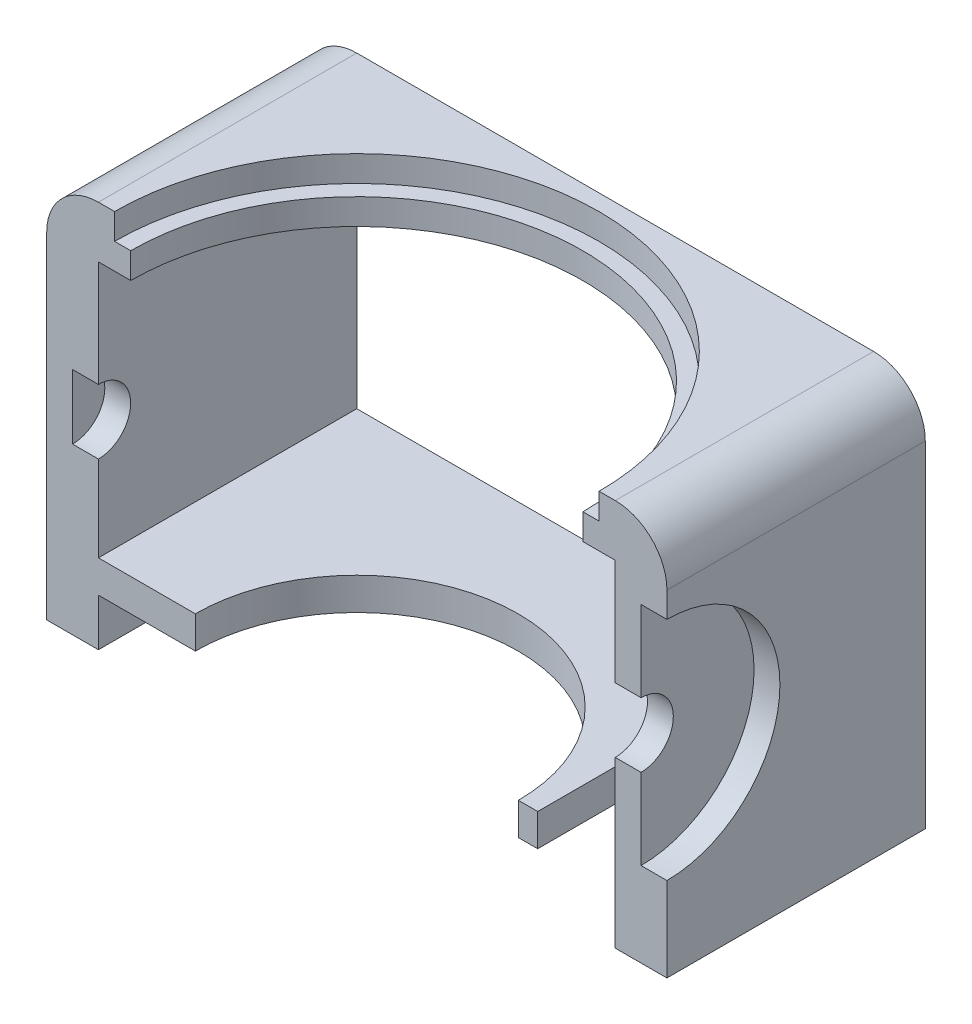
ISO-10303-21;
HEADER;
FILE_DESCRIPTION(('STEP AP214'),'2;1');
FILE_NAME('part.step','',(''),(''),'','','');
FILE_SCHEMA(('AUTOMOTIVE_DESIGN { 1 0 10303 214 1 1 1 1 }'));
ENDSEC;
DATA;
#1=APPLICATION_CONTEXT('core data for automotive mechanical design processes');
#2=APPLICATION_PROTOCOL_DEFINITION('international standard','automotive_design',2000,#1);
#3=PRODUCT_CONTEXT('',#1,'mechanical');
#4=PRODUCT('Part','Part','',(#3));
#5=PRODUCT_RELATED_PRODUCT_CATEGORY('part','',(#4));
#6=PRODUCT_DEFINITION_FORMATION('','',#4);
#7=PRODUCT_DEFINITION_CONTEXT('part definition',#1,'design');
#8=PRODUCT_DEFINITION('design','',#6,#7);
#9=PRODUCT_DEFINITION_SHAPE('','',#8);
#10=(LENGTH_UNIT() NAMED_UNIT(*) SI_UNIT(.MILLI.,.METRE.));
#11=(NAMED_UNIT(*) PLANE_ANGLE_UNIT() SI_UNIT($,.RADIAN.));
#12=(NAMED_UNIT(*) SI_UNIT($,.STERADIAN.) SOLID_ANGLE_UNIT());
#13=UNCERTAINTY_MEASURE_WITH_UNIT(LENGTH_MEASURE(1.E-05),#10,'distance_accuracy_value','');
#14=(GEOMETRIC_REPRESENTATION_CONTEXT(3) GLOBAL_UNCERTAINTY_ASSIGNED_CONTEXT((#13)) GLOBAL_UNIT_ASSIGNED_CONTEXT((#10,
#11,#12)) REPRESENTATION_CONTEXT('',''));
#15=CARTESIAN_POINT('',(0.,0.,0.));
#16=DIRECTION('',(0.,0.,1.));
#17=DIRECTION('',(1.,0.,0.));
#18=AXIS2_PLACEMENT_3D('',#15,#16,#17);
#19=CARTESIAN_POINT('',(0.,0.,80.));
#20=DIRECTION('',(-1.,0.,0.));
#21=DIRECTION('',(0.,0.,1.));
#22=AXIS2_PLACEMENT_3D('',#19,#20,#21);
#23=PLANE('',#22);
#24=DIRECTION('',(0.,1.,0.));
#25=VECTOR('',#24,1.);
#26=CARTESIAN_POINT('',(0.,0.,39.99));
#27=LINE('',#26,#25);
#28=CARTESIAN_POINT('',(0.,0.,39.99));
#29=VERTEX_POINT('',#28);
#30=CARTESIAN_POINT('',(0.,13.0700028571431,39.99));
#31=VERTEX_POINT('',#30);
#32=EDGE_CURVE('E281',#29,#31,#27,.T.);
#33=ORIENTED_EDGE('',*,*,#32,.F.);
#34=DIRECTION('',(0.,0.,-1.));
#35=VECTOR('',#34,1.);
#36=CARTESIAN_POINT('',(0.,0.,80.));
#37=LINE('',#36,#35);
#38=CARTESIAN_POINT('',(0.,0.,0.));
#39=VERTEX_POINT('',#38);
#40=EDGE_CURVE('E272',#29,#39,#37,.T.);
#41=ORIENTED_EDGE('',*,*,#40,.T.);
#42=DIRECTION('',(0.,1.,0.));
#43=VECTOR('',#42,1.);
#44=CARTESIAN_POINT('',(0.,0.,0.));
#45=LINE('',#44,#43);
#46=CARTESIAN_POINT('',(0.,52.,0.));
#47=VERTEX_POINT('',#46);
#48=EDGE_CURVE('E271',#39,#47,#45,.T.);
#49=ORIENTED_EDGE('',*,*,#48,.T.);
#50=DIRECTION('',(0.,0.,-1.));
#51=VECTOR('',#50,1.);
#52=CARTESIAN_POINT('',(0.,52.,80.));
#53=LINE('',#52,#51);
#54=CARTESIAN_POINT('',(0.,52.,39.99));
#55=VERTEX_POINT('',#54);
#56=EDGE_CURVE('E268',#55,#47,#53,.T.);
#57=ORIENTED_EDGE('',*,*,#56,.F.);
#58=CARTESIAN_POINT('',(0.,48.0699971428569,39.99));
#59=VERTEX_POINT('',#58);
#60=EDGE_CURVE('E277',#59,#55,#27,.T.);
#61=ORIENTED_EDGE('',*,*,#60,.F.);
#62=CARTESIAN_POINT('',(0.,30.57,40.));
#63=DIRECTION('',(1.,0.,0.));
#64=DIRECTION('',(0.,0.,-1.));
#65=AXIS2_PLACEMENT_3D('',#62,#63,#64);
#66=CIRCLE('',#65,17.5);
#67=EDGE_CURVE('E181',#31,#59,#66,.T.);
#68=ORIENTED_EDGE('',*,*,#67,.F.);
#69=EDGE_LOOP('',(#33,#41,#49,#57,#61,#68));
#70=FACE_BOUND('',#69,.T.);
#71=ADVANCED_FACE('F32',(#70),#23,.F.);
#72=CARTESIAN_POINT('',(-92.,52.,80.));
#73=DIRECTION('',(1.,0.,0.));
#74=DIRECTION('',(0.,1.,0.));
#75=AXIS2_PLACEMENT_3D('',#72,#73,#74);
#76=PLANE('',#75);
#77=CARTESIAN_POINT('',(-92.,30.57,40.));
#78=DIRECTION('',(1.,0.,0.));
#79=DIRECTION('',(0.,1.,0.));
#80=AXIS2_PLACEMENT_3D('',#77,#78,#79);
#81=CIRCLE('',#80,5.);
#82=CARTESIAN_POINT('',(-92.,35.56998999999,39.99));
#83=VERTEX_POINT('',#82);
#84=CARTESIAN_POINT('',(-92.,25.57001000001,39.99));
#85=VERTEX_POINT('',#84);
#86=EDGE_CURVE('E171',#83,#85,#81,.F.);
#87=ORIENTED_EDGE('',*,*,#86,.F.);
#88=DIRECTION('',(0.,1.,0.));
#89=VECTOR('',#88,1.);
#90=CARTESIAN_POINT('',(-92.,52.,39.99));
#91=LINE('',#90,#89);
#92=EDGE_CURVE('E36',#83,#85,#91,.F.);
#93=ORIENTED_EDGE('',*,*,#92,.T.);
#94=EDGE_LOOP('',(#87,#93));
#95=FACE_BOUND('',#94,.T.);
#96=ADVANCED_FACE('F170',(#95),#76,.T.);
#97=CARTESIAN_POINT('',(-110.142135623731,30.57,40.));
#98=DIRECTION('',(1.,0.,0.));
#99=DIRECTION('',(0.,0.,-1.));
#100=AXIS2_PLACEMENT_3D('',#97,#98,#99);
#101=CYLINDRICAL_SURFACE('',#100,5.);
#102=DIRECTION('',(1.,0.,0.));
#103=VECTOR('',#102,1.);
#104=CARTESIAN_POINT('',(-110.142135623731,25.57001000001,39.99));
#105=LINE('',#104,#103);
#106=CARTESIAN_POINT('',(-88.,25.57001000001,39.99));
#107=VERTEX_POINT('',#106);
#108=EDGE_CURVE('E157',#107,#85,#105,.F.);
#109=ORIENTED_EDGE('',*,*,#108,.F.);
#110=CARTESIAN_POINT('',(-88.,30.57,40.));
#111=DIRECTION('',(1.,0.,0.));
#112=DIRECTION('',(0.,0.,-1.));
#113=AXIS2_PLACEMENT_3D('',#110,#111,#112);
#114=CIRCLE('',#113,5.);
#115=CARTESIAN_POINT('',(-88.,35.56998999999,39.99));
#116=VERTEX_POINT('',#115);
#117=EDGE_CURVE('E172',#107,#116,#114,.T.);
#118=ORIENTED_EDGE('',*,*,#117,.T.);
#119=DIRECTION('',(1.,0.,0.));
#120=VECTOR('',#119,1.);
#121=CARTESIAN_POINT('',(-110.142135623731,35.56998999999,39.99));
#122=LINE('',#121,#120);
#123=EDGE_CURVE('E165',#83,#116,#122,.T.);
#124=ORIENTED_EDGE('',*,*,#123,.F.);
#125=ORIENTED_EDGE('',*,*,#86,.T.);
#126=EDGE_LOOP('',(#109,#118,#124,#125));
#127=FACE_BOUND('',#126,.T.);
#128=ADVANCED_FACE('F174',(#127),#101,.F.);
#129=CARTESIAN_POINT('',(-48.,0.,40.));
#130=DIRECTION('',(0.,1.,0.));
#131=DIRECTION('',(-1.,0.,0.));
#132=AXIS2_PLACEMENT_3D('',#129,#130,#131);
#133=CYLINDRICAL_SURFACE('',#132,25.);
#134=DIRECTION('',(0.,1.,0.));
#135=VECTOR('',#134,1.);
#136=CARTESIAN_POINT('',(-23.0000020000001,0.,39.99));
#137=LINE('',#136,#135);
#138=CARTESIAN_POINT('',(-23.0000020000001,12.3229289976864,39.99));
#139=VERTEX_POINT('',#138);
#140=CARTESIAN_POINT('',(-23.0000020000001,7.32292899768644,39.99));
#141=VERTEX_POINT('',#140);
#142=EDGE_CURVE('E323',#139,#141,#137,.F.);
#143=ORIENTED_EDGE('',*,*,#142,.F.);
#144=CARTESIAN_POINT('',(-48.,12.3229289976864,40.));
#145=DIRECTION('',(0.,1.,0.));
#146=DIRECTION('',(-1.,0.,0.));
#147=AXIS2_PLACEMENT_3D('',#144,#145,#146);
#148=CIRCLE('',#147,25.);
#149=CARTESIAN_POINT('',(-72.9999979999999,12.3229289976864,39.99));
#150=VERTEX_POINT('',#149);
#151=EDGE_CURVE('E202',#139,#150,#148,.T.);
#152=ORIENTED_EDGE('',*,*,#151,.T.);
#153=DIRECTION('',(0.,1.,0.));
#154=VECTOR('',#153,1.);
#155=CARTESIAN_POINT('',(-72.9999979999999,0.,39.99));
#156=LINE('',#155,#154);
#157=CARTESIAN_POINT('',(-72.9999979999999,7.32292899768644,39.99));
#158=VERTEX_POINT('',#157);
#159=EDGE_CURVE('E321',#158,#150,#156,.T.);
#160=ORIENTED_EDGE('',*,*,#159,.F.);
#161=CARTESIAN_POINT('',(-48.,7.32292899768644,40.));
#162=DIRECTION('',(0.,1.,0.));
#163=DIRECTION('',(0.,0.,1.));
#164=AXIS2_PLACEMENT_3D('',#161,#162,#163);
#165=CIRCLE('',#164,25.);
#166=EDGE_CURVE('E200',#141,#158,#165,.T.);
#167=ORIENTED_EDGE('',*,*,#166,.F.);
#168=EDGE_LOOP('',(#143,#152,#160,#167));
#169=FACE_BOUND('',#168,.T.);
#170=ADVANCED_FACE('F476',(#169),#133,.F.);
#171=CARTESIAN_POINT('',(0.,0.,39.99));
#172=DIRECTION('',(0.,0.,1.));
#173=DIRECTION('',(1.,0.,0.));
#174=AXIS2_PLACEMENT_3D('',#171,#172,#173);
#175=PLANE('',#174);
#176=ORIENTED_EDGE('',*,*,#142,.T.);
#177=DIRECTION('',(1.,0.,0.));
#178=VECTOR('',#177,1.);
#179=CARTESIAN_POINT('',(-88.,7.32292899768644,39.99));
#180=LINE('',#179,#178);
#181=CARTESIAN_POINT('',(-20.,7.32292899768644,39.99));
#182=VERTEX_POINT('',#181);
#183=EDGE_CURVE('E42',#141,#182,#180,.T.);
#184=ORIENTED_EDGE('',*,*,#183,.T.);
#185=DIRECTION('',(0.,1.,0.));
#186=VECTOR('',#185,1.);
#187=CARTESIAN_POINT('',(-20.,0.,39.99));
#188=LINE('',#187,#186);
#189=CARTESIAN_POINT('',(-20.,12.3229289976864,39.99));
#190=VERTEX_POINT('',#189);
#191=EDGE_CURVE('E11',#182,#190,#188,.T.);
#192=ORIENTED_EDGE('',*,*,#191,.T.);
#193=DIRECTION('',(1.,0.,0.));
#194=VECTOR('',#193,1.);
#195=CARTESIAN_POINT('',(-8.,12.3229289976864,39.99));
#196=LINE('',#195,#194);
#197=EDGE_CURVE('E50',#139,#190,#196,.T.);
#198=ORIENTED_EDGE('',*,*,#197,.F.);
#199=EDGE_LOOP('',(#176,#184,#192,#198));
#200=FACE_BOUND('',#199,.T.);
#201=ADVANCED_FACE('F518',(#200),#175,.T.);
#202=CARTESIAN_POINT('',(-20.,0.,25.));
#203=DIRECTION('',(-1.,0.,0.));
#204=DIRECTION('',(0.,-1.,0.));
#205=AXIS2_PLACEMENT_3D('',#202,#203,#204);
#206=PLANE('',#205);
#207=ORIENTED_EDGE('',*,*,#191,.F.);
#208=DIRECTION('',(0.,0.,1.));
#209=VECTOR('',#208,1.);
#210=CARTESIAN_POINT('',(-20.,7.32292899768644,80.));
#211=LINE('',#210,#209);
#212=CARTESIAN_POINT('',(-20.,7.32292899768644,25.));
#213=VERTEX_POINT('',#212);
#214=EDGE_CURVE('E197',#213,#182,#211,.T.);
#215=ORIENTED_EDGE('',*,*,#214,.F.);
#216=DIRECTION('',(0.,1.,0.));
#217=VECTOR('',#216,1.);
#218=CARTESIAN_POINT('',(-20.,0.,25.));
#219=LINE('',#218,#217);
#220=CARTESIAN_POINT('',(-20.,12.3229289976864,25.));
#221=VERTEX_POINT('',#220);
#222=EDGE_CURVE('E196',#213,#221,#219,.T.);
#223=ORIENTED_EDGE('',*,*,#222,.T.);
#224=DIRECTION('',(0.,0.,1.));
#225=VECTOR('',#224,1.);
#226=CARTESIAN_POINT('',(-20.,12.3229289976864,25.));
#227=LINE('',#226,#225);
#228=EDGE_CURVE('E173',#221,#190,#227,.T.);
#229=ORIENTED_EDGE('',*,*,#228,.T.);
#230=EDGE_LOOP('',(#207,#215,#223,#229));
#231=FACE_BOUND('',#230,.T.);
#232=ADVANCED_FACE('F515',(#231),#206,.F.);
#233=ORIENTED_EDGE('',*,*,#108,.T.);
#234=ORIENTED_EDGE('',*,*,#92,.F.);
#235=ORIENTED_EDGE('',*,*,#123,.T.);
#236=DIRECTION('',(0.,-1.,0.));
#237=VECTOR('',#236,1.);
#238=CARTESIAN_POINT('',(-88.,12.3229289976864,39.99));
#239=LINE('',#238,#237);
#240=CARTESIAN_POINT('',(-88.,52.,39.99));
#241=VERTEX_POINT('',#240);
#242=EDGE_CURVE('E233',#241,#116,#239,.T.);
#243=ORIENTED_EDGE('',*,*,#242,.F.);
#244=DIRECTION('',(-1.,0.,0.));
#245=VECTOR('',#244,1.);
#246=CARTESIAN_POINT('',(-88.,52.,39.99));
#247=LINE('',#246,#245);
#248=CARTESIAN_POINT('',(-82.9999985714286,52.,39.99));
#249=VERTEX_POINT('',#248);
#250=EDGE_CURVE('E215',#249,#241,#247,.T.);
#251=ORIENTED_EDGE('',*,*,#250,.F.);
#252=DIRECTION('',(0.,1.,0.));
#253=VECTOR('',#252,1.);
#254=CARTESIAN_POINT('',(-82.9999985714286,52.,39.99));
#255=LINE('',#254,#253);
#256=CARTESIAN_POINT('',(-82.9999985714286,56.,39.99));
#257=VERTEX_POINT('',#256);
#258=EDGE_CURVE('E305',#249,#257,#255,.T.);
#259=ORIENTED_EDGE('',*,*,#258,.T.);
#260=DIRECTION('',(1.,0.,0.));
#261=VECTOR('',#260,1.);
#262=CARTESIAN_POINT('',(-48.,56.,39.99));
#263=LINE('',#262,#261);
#264=CARTESIAN_POINT('',(-85.5,56.,39.99));
#265=VERTEX_POINT('',#264);
#266=EDGE_CURVE('E223',#265,#257,#263,.T.);
#267=ORIENTED_EDGE('',*,*,#266,.F.);
#268=DIRECTION('',(0.,1.,0.));
#269=VECTOR('',#268,1.);
#270=CARTESIAN_POINT('',(-85.4999986666667,56.,39.99));
#271=LINE('',#270,#269);
#272=CARTESIAN_POINT('',(-85.4999986666667,60.,39.99));
#273=VERTEX_POINT('',#272);
#274=EDGE_CURVE('E309',#265,#273,#271,.T.);
#275=ORIENTED_EDGE('',*,*,#274,.T.);
#276=DIRECTION('',(-1.,0.,0.));
#277=VECTOR('',#276,1.);
#278=CARTESIAN_POINT('',(-8.00000000000001,60.,39.99));
#279=LINE('',#278,#277);
#280=CARTESIAN_POINT('',(-88.,60.,39.99));
#281=VERTEX_POINT('',#280);
#282=EDGE_CURVE('E293',#273,#281,#279,.T.);
#283=ORIENTED_EDGE('',*,*,#282,.T.);
#284=CARTESIAN_POINT('',(-88.,52.,39.99));
#285=DIRECTION('',(0.,0.,1.));
#286=DIRECTION('',(1.,0.,0.));
#287=AXIS2_PLACEMENT_3D('',#284,#285,#286);
#288=CIRCLE('',#287,8.);
#289=CARTESIAN_POINT('',(-96.,52.,39.99));
#290=VERTEX_POINT('',#289);
#291=EDGE_CURVE('E311',#281,#290,#288,.T.);
#292=ORIENTED_EDGE('',*,*,#291,.T.);
#293=DIRECTION('',(0.,-1.,0.));
#294=VECTOR('',#293,1.);
#295=CARTESIAN_POINT('',(-96.,52.,39.99));
#296=LINE('',#295,#294);
#297=CARTESIAN_POINT('',(-96.,0.,39.99));
#298=VERTEX_POINT('',#297);
#299=EDGE_CURVE('E313',#290,#298,#296,.T.);
#300=ORIENTED_EDGE('',*,*,#299,.T.);
#301=DIRECTION('',(1.,0.,0.));
#302=VECTOR('',#301,1.);
#303=CARTESIAN_POINT('',(-96.,0.,39.99));
#304=LINE('',#303,#302);
#305=CARTESIAN_POINT('',(-88.,0.,39.99));
#306=VERTEX_POINT('',#305);
#307=EDGE_CURVE('E315',#298,#306,#304,.T.);
#308=ORIENTED_EDGE('',*,*,#307,.T.);
#309=DIRECTION('',(0.,1.,0.));
#310=VECTOR('',#309,1.);
#311=CARTESIAN_POINT('',(-88.,0.,39.99));
#312=LINE('',#311,#310);
#313=CARTESIAN_POINT('',(-88.,7.32292899768644,39.99));
#314=VERTEX_POINT('',#313);
#315=EDGE_CURVE('E317',#306,#314,#312,.T.);
#316=ORIENTED_EDGE('',*,*,#315,.T.);
#317=EDGE_CURVE('E319',#314,#158,#180,.T.);
#318=ORIENTED_EDGE('',*,*,#317,.T.);
#319=ORIENTED_EDGE('',*,*,#159,.T.);
#320=CARTESIAN_POINT('',(-88.,12.3229289976864,39.99));
#321=VERTEX_POINT('',#320);
#322=EDGE_CURVE('E229',#321,#150,#196,.T.);
#323=ORIENTED_EDGE('',*,*,#322,.F.);
#324=EDGE_CURVE('E160',#107,#321,#239,.T.);
#325=ORIENTED_EDGE('',*,*,#324,.F.);
#326=EDGE_LOOP('',(#233,#234,#235,#243,#251,#259,#267,#275,#283,#292,#300,#308,#316,#318,#319,
#323,#325));
#327=FACE_BOUND('',#326,.T.);
#328=ADVANCED_FACE('F158',(#327),#175,.T.);
#329=CARTESIAN_POINT('',(-8.,0.,25.));
#330=DIRECTION('',(0.,0.,-1.));
#331=DIRECTION('',(-1.,0.,0.));
#332=AXIS2_PLACEMENT_3D('',#329,#330,#331);
#333=PLANE('',#332);
#334=DIRECTION('',(0.,1.,0.));
#335=VECTOR('',#334,1.);
#336=CARTESIAN_POINT('',(-8.,0.,25.));
#337=LINE('',#336,#335);
#338=CARTESIAN_POINT('',(-8.,7.32292899768644,25.));
#339=VERTEX_POINT('',#338);
#340=CARTESIAN_POINT('',(-8.,12.3229289976864,25.));
#341=VERTEX_POINT('',#340);
#342=EDGE_CURVE('E329',#339,#341,#337,.T.);
#343=ORIENTED_EDGE('',*,*,#342,.T.);
#344=DIRECTION('',(-1.,0.,0.));
#345=VECTOR('',#344,1.);
#346=CARTESIAN_POINT('',(-8.,12.3229289976864,25.));
#347=LINE('',#346,#345);
#348=EDGE_CURVE('E299',#341,#221,#347,.T.);
#349=ORIENTED_EDGE('',*,*,#348,.T.);
#350=ORIENTED_EDGE('',*,*,#222,.F.);
#351=DIRECTION('',(-1.,0.,0.));
#352=VECTOR('',#351,1.);
#353=CARTESIAN_POINT('',(-88.,7.32292899768644,25.));
#354=LINE('',#353,#352);
#355=EDGE_CURVE('E201',#339,#213,#354,.T.);
#356=ORIENTED_EDGE('',*,*,#355,.F.);
#357=EDGE_LOOP('',(#343,#349,#350,#356));
#358=FACE_BOUND('',#357,.T.);
#359=ADVANCED_FACE('F513',(#358),#333,.F.);
#360=CARTESIAN_POINT('',(-8.,12.3229289976864,80.));
#361=DIRECTION('',(0.,1.,0.));
#362=DIRECTION('',(-1.,0.,0.));
#363=AXIS2_PLACEMENT_3D('',#360,#361,#362);
#364=PLANE('',#363);
#365=DIRECTION('',(0.,0.,-1.));
#366=VECTOR('',#365,1.);
#367=CARTESIAN_POINT('',(-88.,12.3229289976864,80.));
#368=LINE('',#367,#366);
#369=CARTESIAN_POINT('',(-88.,12.3229289976864,0.));
#370=VERTEX_POINT('',#369);
#371=EDGE_CURVE('E226',#321,#370,#368,.T.);
#372=ORIENTED_EDGE('',*,*,#371,.F.);
#373=ORIENTED_EDGE('',*,*,#322,.T.);
#374=ORIENTED_EDGE('',*,*,#151,.F.);
#375=ORIENTED_EDGE('',*,*,#197,.T.);
#376=ORIENTED_EDGE('',*,*,#228,.F.);
#377=ORIENTED_EDGE('',*,*,#348,.F.);
#378=DIRECTION('',(0.,0.,-1.));
#379=VECTOR('',#378,1.);
#380=CARTESIAN_POINT('',(-8.,12.3229289976864,80.));
#381=LINE('',#380,#379);
#382=CARTESIAN_POINT('',(-8.,12.3229289976864,0.));
#383=VERTEX_POINT('',#382);
#384=EDGE_CURVE('E220',#341,#383,#381,.T.);
#385=ORIENTED_EDGE('',*,*,#384,.T.);
#386=DIRECTION('',(1.,0.,0.));
#387=VECTOR('',#386,1.);
#388=CARTESIAN_POINT('',(-8.,12.3229289976864,0.));
#389=LINE('',#388,#387);
#390=EDGE_CURVE('E334',#370,#383,#389,.T.);
#391=ORIENTED_EDGE('',*,*,#390,.F.);
#392=EDGE_LOOP('',(#372,#373,#374,#375,#376,#377,#385,#391));
#393=FACE_BOUND('',#392,.T.);
#394=ADVANCED_FACE('F479',(#393),#364,.T.);
#395=CARTESIAN_POINT('',(-88.,12.3229289976864,80.));
#396=DIRECTION('',(1.,0.,0.));
#397=DIRECTION('',(0.,0.,-1.));
#398=AXIS2_PLACEMENT_3D('',#395,#396,#397);
#399=PLANE('',#398);
#400=DIRECTION('',(0.,0.,-1.));
#401=VECTOR('',#400,1.);
#402=CARTESIAN_POINT('',(-88.,52.,80.));
#403=LINE('',#402,#401);
#404=CARTESIAN_POINT('',(-88.,52.,0.));
#405=VERTEX_POINT('',#404);
#406=EDGE_CURVE('E230',#241,#405,#403,.T.);
#407=ORIENTED_EDGE('',*,*,#406,.F.);
#408=ORIENTED_EDGE('',*,*,#242,.T.);
#409=ORIENTED_EDGE('',*,*,#117,.F.);
#410=ORIENTED_EDGE('',*,*,#324,.T.);
#411=ORIENTED_EDGE('',*,*,#371,.T.);
#412=DIRECTION('',(0.,-1.,0.));
#413=VECTOR('',#412,1.);
#414=CARTESIAN_POINT('',(-88.,12.3229289976864,0.));
#415=LINE('',#414,#413);
#416=EDGE_CURVE('E342',#405,#370,#415,.T.);
#417=ORIENTED_EDGE('',*,*,#416,.F.);
#418=EDGE_LOOP('',(#407,#408,#409,#410,#411,#417));
#419=FACE_BOUND('',#418,.T.);
#420=ADVANCED_FACE('F483',(#419),#399,.T.);
#421=CARTESIAN_POINT('',(-88.,52.,80.));
#422=DIRECTION('',(0.,0.,-1.));
#423=DIRECTION('',(-1.,0.,0.));
#424=AXIS2_PLACEMENT_3D('',#421,#422,#423);
#425=CYLINDRICAL_SURFACE('',#424,8.);
#426=ORIENTED_EDGE('',*,*,#291,.F.);
#427=DIRECTION('',(0.,0.,-1.));
#428=VECTOR('',#427,1.);
#429=CARTESIAN_POINT('',(-88.,60.,80.));
#430=LINE('',#429,#428);
#431=CARTESIAN_POINT('',(-88.,60.,0.));
#432=VERTEX_POINT('',#431);
#433=EDGE_CURVE('E260',#281,#432,#430,.T.);
#434=ORIENTED_EDGE('',*,*,#433,.T.);
#435=CARTESIAN_POINT('',(-88.,52.,0.));
#436=DIRECTION('',(0.,0.,1.));
#437=DIRECTION('',(1.,0.,0.));
#438=AXIS2_PLACEMENT_3D('',#435,#436,#437);
#439=CIRCLE('',#438,8.);
#440=CARTESIAN_POINT('',(-96.,52.,0.));
#441=VERTEX_POINT('',#440);
#442=EDGE_CURVE('E259',#432,#441,#439,.T.);
#443=ORIENTED_EDGE('',*,*,#442,.T.);
#444=DIRECTION('',(0.,0.,-1.));
#445=VECTOR('',#444,1.);
#446=CARTESIAN_POINT('',(-96.,52.,80.));
#447=LINE('',#446,#445);
#448=EDGE_CURVE('E256',#290,#441,#447,.T.);
#449=ORIENTED_EDGE('',*,*,#448,.F.);
#450=EDGE_LOOP('',(#426,#434,#443,#449));
#451=FACE_BOUND('',#450,.T.);
#452=ADVANCED_FACE('F452',(#451),#425,.T.);
#453=CARTESIAN_POINT('',(-96.,52.,80.));
#454=DIRECTION('',(1.,0.,0.));
#455=DIRECTION('',(0.,1.,0.));
#456=AXIS2_PLACEMENT_3D('',#453,#454,#455);
#457=PLANE('',#456);
#458=ORIENTED_EDGE('',*,*,#299,.F.);
#459=ORIENTED_EDGE('',*,*,#448,.T.);
#460=DIRECTION('',(0.,-1.,0.));
#461=VECTOR('',#460,1.);
#462=CARTESIAN_POINT('',(-96.,52.,0.));
#463=LINE('',#462,#461);
#464=CARTESIAN_POINT('',(-96.,0.,0.));
#465=VERTEX_POINT('',#464);
#466=EDGE_CURVE('E255',#441,#465,#463,.T.);
#467=ORIENTED_EDGE('',*,*,#466,.T.);
#468=DIRECTION('',(0.,0.,-1.));
#469=VECTOR('',#468,1.);
#470=CARTESIAN_POINT('',(-96.,0.,80.));
#471=LINE('',#470,#469);
#472=EDGE_CURVE('E252',#298,#465,#471,.T.);
#473=ORIENTED_EDGE('',*,*,#472,.F.);
#474=EDGE_LOOP('',(#458,#459,#467,#473));
#475=FACE_BOUND('',#474,.T.);
#476=ADVANCED_FACE('F446',(#475),#457,.F.);
#477=CARTESIAN_POINT('',(-96.,0.,80.));
#478=DIRECTION('',(0.,1.,0.));
#479=DIRECTION('',(0.,0.,1.));
#480=AXIS2_PLACEMENT_3D('',#477,#478,#479);
#481=PLANE('',#480);
#482=ORIENTED_EDGE('',*,*,#307,.F.);
#483=ORIENTED_EDGE('',*,*,#472,.T.);
#484=DIRECTION('',(1.,0.,0.));
#485=VECTOR('',#484,1.);
#486=CARTESIAN_POINT('',(-96.,0.,0.));
#487=LINE('',#486,#485);
#488=CARTESIAN_POINT('',(-88.,0.,0.));
#489=VERTEX_POINT('',#488);
#490=EDGE_CURVE('E251',#465,#489,#487,.T.);
#491=ORIENTED_EDGE('',*,*,#490,.T.);
#492=DIRECTION('',(0.,0.,-1.));
#493=VECTOR('',#492,1.);
#494=CARTESIAN_POINT('',(-88.,0.,80.));
#495=LINE('',#494,#493);
#496=EDGE_CURVE('E248',#306,#489,#495,.T.);
#497=ORIENTED_EDGE('',*,*,#496,.F.);
#498=EDGE_LOOP('',(#482,#483,#491,#497));
#499=FACE_BOUND('',#498,.T.);
#500=ADVANCED_FACE('F462',(#499),#481,.F.);
#501=CARTESIAN_POINT('',(-88.,0.,80.));
#502=DIRECTION('',(-1.,0.,0.));
#503=DIRECTION('',(0.,0.,1.));
#504=AXIS2_PLACEMENT_3D('',#501,#502,#503);
#505=PLANE('',#504);
#506=ORIENTED_EDGE('',*,*,#315,.F.);
#507=ORIENTED_EDGE('',*,*,#496,.T.);
#508=DIRECTION('',(0.,1.,0.));
#509=VECTOR('',#508,1.);
#510=CARTESIAN_POINT('',(-88.,0.,0.));
#511=LINE('',#510,#509);
#512=CARTESIAN_POINT('',(-88.,7.32292899768644,0.));
#513=VERTEX_POINT('',#512);
#514=EDGE_CURVE('E247',#489,#513,#511,.T.);
#515=ORIENTED_EDGE('',*,*,#514,.T.);
#516=DIRECTION('',(0.,0.,-1.));
#517=VECTOR('',#516,1.);
#518=CARTESIAN_POINT('',(-88.,7.32292899768644,80.));
#519=LINE('',#518,#517);
#520=EDGE_CURVE('E243',#314,#513,#519,.T.);
#521=ORIENTED_EDGE('',*,*,#520,.F.);
#522=EDGE_LOOP('',(#506,#507,#515,#521));
#523=FACE_BOUND('',#522,.T.);
#524=ADVANCED_FACE('F467',(#523),#505,.F.);
#525=CARTESIAN_POINT('',(-88.,7.32292899768644,80.));
#526=DIRECTION('',(0.,1.,0.));
#527=DIRECTION('',(0.,0.,1.));
#528=AXIS2_PLACEMENT_3D('',#525,#526,#527);
#529=PLANE('',#528);
#530=ORIENTED_EDGE('',*,*,#317,.F.);
#531=ORIENTED_EDGE('',*,*,#520,.T.);
#532=DIRECTION('',(1.,0.,0.));
#533=VECTOR('',#532,1.);
#534=CARTESIAN_POINT('',(-88.,7.32292899768644,0.));
#535=LINE('',#534,#533);
#536=CARTESIAN_POINT('',(-8.00000000000001,7.32292899768644,0.));
#537=VERTEX_POINT('',#536);
#538=EDGE_CURVE('E246',#513,#537,#535,.T.);
#539=ORIENTED_EDGE('',*,*,#538,.T.);
#540=DIRECTION('',(0.,0.,-1.));
#541=VECTOR('',#540,1.);
#542=CARTESIAN_POINT('',(-8.00000000000001,7.32292899768644,80.));
#543=LINE('',#542,#541);
#544=EDGE_CURVE('E236',#339,#537,#543,.T.);
#545=ORIENTED_EDGE('',*,*,#544,.F.);
#546=ORIENTED_EDGE('',*,*,#355,.T.);
#547=ORIENTED_EDGE('',*,*,#214,.T.);
#548=ORIENTED_EDGE('',*,*,#183,.F.);
#549=ORIENTED_EDGE('',*,*,#166,.T.);
#550=EDGE_LOOP('',(#530,#531,#539,#545,#546,#547,#548,#549));
#551=FACE_BOUND('',#550,.T.);
#552=ADVANCED_FACE('F469',(#551),#529,.F.);
#553=CARTESIAN_POINT('',(-8.00000000000001,60.,80.));
#554=DIRECTION('',(0.,-1.,0.));
#555=DIRECTION('',(1.,0.,0.));
#556=AXIS2_PLACEMENT_3D('',#553,#554,#555);
#557=PLANE('',#556);
#558=CARTESIAN_POINT('',(-8.00000000000001,60.,39.99));
#559=VERTEX_POINT('',#558);
#560=CARTESIAN_POINT('',(-10.5000013333334,60.,39.99));
#561=VERTEX_POINT('',#560);
#562=EDGE_CURVE('E289',#559,#561,#279,.T.);
#563=ORIENTED_EDGE('',*,*,#562,.F.);
#564=DIRECTION('',(0.,0.,-1.));
#565=VECTOR('',#564,1.);
#566=CARTESIAN_POINT('',(-8.00000000000001,60.,80.));
#567=LINE('',#566,#565);
#568=CARTESIAN_POINT('',(-8.00000000000001,60.,0.));
#569=VERTEX_POINT('',#568);
#570=EDGE_CURVE('E264',#559,#569,#567,.T.);
#571=ORIENTED_EDGE('',*,*,#570,.T.);
#572=DIRECTION('',(-1.,0.,0.));
#573=VECTOR('',#572,1.);
#574=CARTESIAN_POINT('',(-8.00000000000001,60.,0.));
#575=LINE('',#574,#573);
#576=EDGE_CURVE('E263',#569,#432,#575,.T.);
#577=ORIENTED_EDGE('',*,*,#576,.T.);
#578=ORIENTED_EDGE('',*,*,#433,.F.);
#579=ORIENTED_EDGE('',*,*,#282,.F.);
#580=CARTESIAN_POINT('',(-48.,60.,40.));
#581=DIRECTION('',(0.,1.,0.));
#582=DIRECTION('',(-1.,0.,0.));
#583=AXIS2_PLACEMENT_3D('',#580,#581,#582);
#584=CIRCLE('',#583,37.5);
#585=EDGE_CURVE('E216',#561,#273,#584,.T.);
#586=ORIENTED_EDGE('',*,*,#585,.F.);
#587=EDGE_LOOP('',(#563,#571,#577,#578,#579,#586));
#588=FACE_BOUND('',#587,.T.);
#589=ADVANCED_FACE('F398',(#588),#557,.F.);
#590=CARTESIAN_POINT('',(-8.00000000000001,52.,80.));
#591=DIRECTION('',(0.,0.,-1.));
#592=DIRECTION('',(-1.,0.,0.));
#593=AXIS2_PLACEMENT_3D('',#590,#591,#592);
#594=CYLINDRICAL_SURFACE('',#593,8.00000000000001);
#595=CARTESIAN_POINT('',(-8.00000000000001,52.,39.99));
#596=DIRECTION('',(0.,0.,1.));
#597=DIRECTION('',(1.,0.,0.));
#598=AXIS2_PLACEMENT_3D('',#595,#596,#597);
#599=CIRCLE('',#598,8.00000000000001);
#600=EDGE_CURVE('E279',#55,#559,#599,.T.);
#601=ORIENTED_EDGE('',*,*,#600,.F.);
#602=ORIENTED_EDGE('',*,*,#56,.T.);
#603=CARTESIAN_POINT('',(-8.00000000000001,52.,0.));
#604=DIRECTION('',(0.,0.,1.));
#605=DIRECTION('',(1.,0.,0.));
#606=AXIS2_PLACEMENT_3D('',#603,#604,#605);
#607=CIRCLE('',#606,8.00000000000001);
#608=EDGE_CURVE('E267',#47,#569,#607,.T.);
#609=ORIENTED_EDGE('',*,*,#608,.T.);
#610=ORIENTED_EDGE('',*,*,#570,.F.);
#611=EDGE_LOOP('',(#601,#602,#609,#610));
#612=FACE_BOUND('',#611,.T.);
#613=ADVANCED_FACE('F392',(#612),#594,.T.);
#614=DIRECTION('',(1.,0.,0.));
#615=VECTOR('',#614,1.);
#616=CARTESIAN_POINT('',(-110.142135623731,25.57001000001,39.99));
#617=LINE('',#616,#615);
#618=CARTESIAN_POINT('',(-4.,25.57001000001,39.99));
#619=VERTEX_POINT('',#618);
#620=CARTESIAN_POINT('',(-8.00000000000004,25.57001000001,39.99));
#621=VERTEX_POINT('',#620);
#622=EDGE_CURVE('E166',#619,#621,#617,.F.);
#623=ORIENTED_EDGE('',*,*,#622,.F.);
#624=CARTESIAN_POINT('',(-4.,30.57,40.));
#625=DIRECTION('',(1.,0.,0.));
#626=DIRECTION('',(0.,0.,-1.));
#627=AXIS2_PLACEMENT_3D('',#624,#625,#626);
#628=CIRCLE('',#627,5.);
#629=CARTESIAN_POINT('',(-4.,35.56998999999,39.99));
#630=VERTEX_POINT('',#629);
#631=EDGE_CURVE('E186',#630,#619,#628,.F.);
#632=ORIENTED_EDGE('',*,*,#631,.F.);
#633=DIRECTION('',(1.,0.,0.));
#634=VECTOR('',#633,1.);
#635=CARTESIAN_POINT('',(-110.142135623731,35.56998999999,39.99));
#636=LINE('',#635,#634);
#637=CARTESIAN_POINT('',(-8.00000000000004,35.56998999999,39.99));
#638=VERTEX_POINT('',#637);
#639=EDGE_CURVE('E282',#638,#630,#636,.T.);
#640=ORIENTED_EDGE('',*,*,#639,.F.);
#641=CARTESIAN_POINT('',(-8.00000000000004,30.57,40.));
#642=DIRECTION('',(1.,0.,0.));
#643=DIRECTION('',(0.,1.,0.));
#644=AXIS2_PLACEMENT_3D('',#641,#642,#643);
#645=CIRCLE('',#644,5.);
#646=EDGE_CURVE('E189',#621,#638,#645,.T.);
#647=ORIENTED_EDGE('',*,*,#646,.F.);
#648=EDGE_LOOP('',(#623,#632,#640,#647));
#649=FACE_BOUND('',#648,.T.);
#650=ADVANCED_FACE('F538',(#649),#101,.F.);
#651=CARTESIAN_POINT('',(-4.,30.57,40.));
#652=DIRECTION('',(1.,0.,0.));
#653=DIRECTION('',(0.,0.,-1.));
#654=AXIS2_PLACEMENT_3D('',#651,#652,#653);
#655=PLANE('',#654);
#656=CARTESIAN_POINT('',(-4.,30.57,40.));
#657=DIRECTION('',(1.,0.,0.));
#658=DIRECTION('',(0.,0.,-1.));
#659=AXIS2_PLACEMENT_3D('',#656,#657,#658);
#660=CIRCLE('',#659,17.5);
#661=CARTESIAN_POINT('',(-4.,13.0700028571431,39.99));
#662=VERTEX_POINT('',#661);
#663=CARTESIAN_POINT('',(-4.,48.0699971428569,39.99));
#664=VERTEX_POINT('',#663);
#665=EDGE_CURVE('E175',#662,#664,#660,.T.);
#666=ORIENTED_EDGE('',*,*,#665,.T.);
#667=DIRECTION('',(0.,-1.,0.));
#668=VECTOR('',#667,1.);
#669=CARTESIAN_POINT('',(-4.,30.57,39.99));
#670=LINE('',#669,#668);
#671=EDGE_CURVE('E177',#664,#630,#670,.T.);
#672=ORIENTED_EDGE('',*,*,#671,.T.);
#673=ORIENTED_EDGE('',*,*,#631,.T.);
#674=EDGE_CURVE('E184',#619,#662,#670,.T.);
#675=ORIENTED_EDGE('',*,*,#674,.T.);
#676=EDGE_LOOP('',(#666,#672,#673,#675));
#677=FACE_BOUND('',#676,.T.);
#678=ADVANCED_FACE('F566',(#677),#655,.T.);
#679=CARTESIAN_POINT('',(-4.,30.57,40.));
#680=DIRECTION('',(1.,0.,0.));
#681=DIRECTION('',(0.,0.,-1.));
#682=AXIS2_PLACEMENT_3D('',#679,#680,#681);
#683=CYLINDRICAL_SURFACE('',#682,17.5);
#684=DIRECTION('',(1.,0.,0.));
#685=VECTOR('',#684,1.);
#686=CARTESIAN_POINT('',(-4.,13.0700028571431,39.99));
#687=LINE('',#686,#685);
#688=EDGE_CURVE('E303',#31,#662,#687,.F.);
#689=ORIENTED_EDGE('',*,*,#688,.F.);
#690=ORIENTED_EDGE('',*,*,#67,.T.);
#691=DIRECTION('',(1.,0.,0.));
#692=VECTOR('',#691,1.);
#693=CARTESIAN_POINT('',(-4.,48.0699971428569,39.99));
#694=LINE('',#693,#692);
#695=EDGE_CURVE('E280',#664,#59,#694,.T.);
#696=ORIENTED_EDGE('',*,*,#695,.F.);
#697=ORIENTED_EDGE('',*,*,#665,.F.);
#698=EDGE_LOOP('',(#689,#690,#696,#697));
#699=FACE_BOUND('',#698,.T.);
#700=ADVANCED_FACE('F381',(#699),#683,.F.);
#701=CARTESIAN_POINT('',(-8.,0.,80.));
#702=DIRECTION('',(0.,1.,0.));
#703=DIRECTION('',(0.,0.,1.));
#704=AXIS2_PLACEMENT_3D('',#701,#702,#703);
#705=PLANE('',#704);
#706=DIRECTION('',(1.,0.,0.));
#707=VECTOR('',#706,1.);
#708=CARTESIAN_POINT('',(-8.,0.,39.99));
#709=LINE('',#708,#707);
#710=CARTESIAN_POINT('',(-8.,0.,39.99));
#711=VERTEX_POINT('',#710);
#712=EDGE_CURVE('E300',#711,#29,#709,.T.);
#713=ORIENTED_EDGE('',*,*,#712,.F.);
#714=DIRECTION('',(0.,0.,-1.));
#715=VECTOR('',#714,1.);
#716=CARTESIAN_POINT('',(-8.,0.,80.));
#717=LINE('',#716,#715);
#718=CARTESIAN_POINT('',(-8.,0.,0.));
#719=VERTEX_POINT('',#718);
#720=EDGE_CURVE('E237',#711,#719,#717,.T.);
#721=ORIENTED_EDGE('',*,*,#720,.T.);
#722=DIRECTION('',(1.,0.,0.));
#723=VECTOR('',#722,1.);
#724=CARTESIAN_POINT('',(-8.,0.,0.));
#725=LINE('',#724,#723);
#726=EDGE_CURVE('E240',#719,#39,#725,.T.);
#727=ORIENTED_EDGE('',*,*,#726,.T.);
#728=ORIENTED_EDGE('',*,*,#40,.F.);
#729=EDGE_LOOP('',(#713,#721,#727,#728));
#730=FACE_BOUND('',#729,.T.);
#731=ADVANCED_FACE('F34',(#730),#705,.F.);
#732=CARTESIAN_POINT('',(-8.00000000000001,7.32292899768644,80.));
#733=DIRECTION('',(1.,0.,0.));
#734=DIRECTION('',(0.,1.,0.));
#735=AXIS2_PLACEMENT_3D('',#732,#733,#734);
#736=PLANE('',#735);
#737=DIRECTION('',(0.,-1.,0.));
#738=VECTOR('',#737,1.);
#739=CARTESIAN_POINT('',(-8.00000000000001,7.32292899768644,39.99));
#740=LINE('',#739,#738);
#741=CARTESIAN_POINT('',(-8.00000000000005,52.,39.99));
#742=VERTEX_POINT('',#741);
#743=EDGE_CURVE('E284',#742,#638,#740,.T.);
#744=ORIENTED_EDGE('',*,*,#743,.F.);
#745=DIRECTION('',(0.,0.,-1.));
#746=VECTOR('',#745,1.);
#747=CARTESIAN_POINT('',(-8.00000000000001,52.,80.));
#748=LINE('',#747,#746);
#749=CARTESIAN_POINT('',(-8.00000000000001,52.,0.));
#750=VERTEX_POINT('',#749);
#751=EDGE_CURVE('E208',#742,#750,#748,.T.);
#752=ORIENTED_EDGE('',*,*,#751,.T.);
#753=DIRECTION('',(0.,1.,0.));
#754=VECTOR('',#753,1.);
#755=CARTESIAN_POINT('',(-8.00000000000001,52.,0.));
#756=LINE('',#755,#754);
#757=EDGE_CURVE('E183',#383,#750,#756,.T.);
#758=ORIENTED_EDGE('',*,*,#757,.F.);
#759=ORIENTED_EDGE('',*,*,#384,.F.);
#760=ORIENTED_EDGE('',*,*,#342,.F.);
#761=ORIENTED_EDGE('',*,*,#544,.T.);
#762=DIRECTION('',(0.,-1.,0.));
#763=VECTOR('',#762,1.);
#764=CARTESIAN_POINT('',(-8.00000000000001,7.32292899768644,0.));
#765=LINE('',#764,#763);
#766=EDGE_CURVE('E193',#537,#719,#765,.T.);
#767=ORIENTED_EDGE('',*,*,#766,.T.);
#768=ORIENTED_EDGE('',*,*,#720,.F.);
#769=EDGE_CURVE('E287',#621,#711,#740,.T.);
#770=ORIENTED_EDGE('',*,*,#769,.F.);
#771=ORIENTED_EDGE('',*,*,#646,.T.);
#772=EDGE_LOOP('',(#744,#752,#758,#759,#760,#761,#767,#768,#770,#771));
#773=FACE_BOUND('',#772,.T.);
#774=ADVANCED_FACE('F508',(#773),#736,.F.);
#775=ORIENTED_EDGE('',*,*,#769,.T.);
#776=ORIENTED_EDGE('',*,*,#712,.T.);
#777=ORIENTED_EDGE('',*,*,#32,.T.);
#778=ORIENTED_EDGE('',*,*,#688,.T.);
#779=ORIENTED_EDGE('',*,*,#674,.F.);
#780=ORIENTED_EDGE('',*,*,#622,.T.);
#781=EDGE_LOOP('',(#775,#776,#777,#778,#779,#780));
#782=FACE_BOUND('',#781,.T.);
#783=ADVANCED_FACE('F373',(#782),#175,.T.);
#784=CARTESIAN_POINT('',(-88.,52.,80.));
#785=DIRECTION('',(0.,-1.,0.));
#786=DIRECTION('',(0.,0.,-1.));
#787=AXIS2_PLACEMENT_3D('',#784,#785,#786);
#788=PLANE('',#787);
#789=ORIENTED_EDGE('',*,*,#751,.F.);
#790=CARTESIAN_POINT('',(-13.0000014285715,52.,39.99));
#791=VERTEX_POINT('',#790);
#792=EDGE_CURVE('E192',#742,#791,#247,.T.);
#793=ORIENTED_EDGE('',*,*,#792,.T.);
#794=CARTESIAN_POINT('',(-48.,52.,40.));
#795=DIRECTION('',(0.,1.,0.));
#796=DIRECTION('',(-1.,0.,0.));
#797=AXIS2_PLACEMENT_3D('',#794,#795,#796);
#798=CIRCLE('',#797,35.);
#799=EDGE_CURVE('E212',#791,#249,#798,.T.);
#800=ORIENTED_EDGE('',*,*,#799,.T.);
#801=ORIENTED_EDGE('',*,*,#250,.T.);
#802=ORIENTED_EDGE('',*,*,#406,.T.);
#803=DIRECTION('',(-1.,0.,0.));
#804=VECTOR('',#803,1.);
#805=CARTESIAN_POINT('',(-88.,52.,0.));
#806=LINE('',#805,#804);
#807=EDGE_CURVE('E339',#750,#405,#806,.T.);
#808=ORIENTED_EDGE('',*,*,#807,.F.);
#809=EDGE_LOOP('',(#789,#793,#800,#801,#802,#808));
#810=FACE_BOUND('',#809,.T.);
#811=ADVANCED_FACE('F489',(#810),#788,.T.);
#812=CARTESIAN_POINT('',(-48.,52.,40.));
#813=DIRECTION('',(0.,1.,0.));
#814=DIRECTION('',(-1.,0.,0.));
#815=AXIS2_PLACEMENT_3D('',#812,#813,#814);
#816=CYLINDRICAL_SURFACE('',#815,35.);
#817=DIRECTION('',(0.,1.,0.));
#818=VECTOR('',#817,1.);
#819=CARTESIAN_POINT('',(-13.0000014285715,52.,39.99));
#820=LINE('',#819,#818);
#821=CARTESIAN_POINT('',(-13.0000014285715,56.,39.99));
#822=VERTEX_POINT('',#821);
#823=EDGE_CURVE('E286',#822,#791,#820,.F.);
#824=ORIENTED_EDGE('',*,*,#823,.F.);
#825=CARTESIAN_POINT('',(-48.,56.,40.));
#826=DIRECTION('',(0.,1.,0.));
#827=DIRECTION('',(-1.,0.,0.));
#828=AXIS2_PLACEMENT_3D('',#825,#826,#827);
#829=CIRCLE('',#828,35.);
#830=EDGE_CURVE('E205',#822,#257,#829,.T.);
#831=ORIENTED_EDGE('',*,*,#830,.T.);
#832=ORIENTED_EDGE('',*,*,#258,.F.);
#833=ORIENTED_EDGE('',*,*,#799,.F.);
#834=EDGE_LOOP('',(#824,#831,#832,#833));
#835=FACE_BOUND('',#834,.T.);
#836=ADVANCED_FACE('F494',(#835),#816,.F.);
#837=CARTESIAN_POINT('',(-48.,56.,40.));
#838=DIRECTION('',(0.,1.,0.));
#839=DIRECTION('',(-1.,0.,0.));
#840=AXIS2_PLACEMENT_3D('',#837,#838,#839);
#841=PLANE('',#840);
#842=CARTESIAN_POINT('',(-48.,56.,40.));
#843=DIRECTION('',(0.,1.,0.));
#844=DIRECTION('',(-1.,0.,0.));
#845=AXIS2_PLACEMENT_3D('',#842,#843,#844);
#846=CIRCLE('',#845,37.5);
#847=CARTESIAN_POINT('',(-10.5,56.,39.99));
#848=VERTEX_POINT('',#847);
#849=EDGE_CURVE('E219',#848,#265,#846,.T.);
#850=ORIENTED_EDGE('',*,*,#849,.T.);
#851=ORIENTED_EDGE('',*,*,#266,.T.);
#852=ORIENTED_EDGE('',*,*,#830,.F.);
#853=EDGE_CURVE('E211',#822,#848,#263,.T.);
#854=ORIENTED_EDGE('',*,*,#853,.T.);
#855=EDGE_LOOP('',(#850,#851,#852,#854));
#856=FACE_BOUND('',#855,.T.);
#857=ADVANCED_FACE('F499',(#856),#841,.T.);
#858=CARTESIAN_POINT('',(-48.,56.,40.));
#859=DIRECTION('',(0.,1.,0.));
#860=DIRECTION('',(-1.,0.,0.));
#861=AXIS2_PLACEMENT_3D('',#858,#859,#860);
#862=CYLINDRICAL_SURFACE('',#861,37.5);
#863=DIRECTION('',(0.,1.,0.));
#864=VECTOR('',#863,1.);
#865=CARTESIAN_POINT('',(-10.5000013333334,56.,39.99));
#866=LINE('',#865,#864);
#867=EDGE_CURVE('E295',#561,#848,#866,.F.);
#868=ORIENTED_EDGE('',*,*,#867,.F.);
#869=ORIENTED_EDGE('',*,*,#585,.T.);
#870=ORIENTED_EDGE('',*,*,#274,.F.);
#871=ORIENTED_EDGE('',*,*,#849,.F.);
#872=EDGE_LOOP('',(#868,#869,#870,#871));
#873=FACE_BOUND('',#872,.T.);
#874=ADVANCED_FACE('F503',(#873),#862,.F.);
#875=ORIENTED_EDGE('',*,*,#867,.T.);
#876=ORIENTED_EDGE('',*,*,#853,.F.);
#877=ORIENTED_EDGE('',*,*,#823,.T.);
#878=ORIENTED_EDGE('',*,*,#792,.F.);
#879=ORIENTED_EDGE('',*,*,#743,.T.);
#880=ORIENTED_EDGE('',*,*,#639,.T.);
#881=ORIENTED_EDGE('',*,*,#671,.F.);
#882=ORIENTED_EDGE('',*,*,#695,.T.);
#883=ORIENTED_EDGE('',*,*,#60,.T.);
#884=ORIENTED_EDGE('',*,*,#600,.T.);
#885=ORIENTED_EDGE('',*,*,#562,.T.);
#886=EDGE_LOOP('',(#875,#876,#877,#878,#879,#880,#881,#882,#883,#884,#885));
#887=FACE_BOUND('',#886,.T.);
#888=ADVANCED_FACE('F387',(#887),#175,.T.);
#889=CARTESIAN_POINT('',(-8.00000000000001,52.,0.));
#890=DIRECTION('',(0.,0.,1.));
#891=DIRECTION('',(1.,0.,0.));
#892=AXIS2_PLACEMENT_3D('',#889,#890,#891);
#893=PLANE('',#892);
#894=ORIENTED_EDGE('',*,*,#726,.F.);
#895=ORIENTED_EDGE('',*,*,#766,.F.);
#896=ORIENTED_EDGE('',*,*,#538,.F.);
#897=ORIENTED_EDGE('',*,*,#514,.F.);
#898=ORIENTED_EDGE('',*,*,#490,.F.);
#899=ORIENTED_EDGE('',*,*,#466,.F.);
#900=ORIENTED_EDGE('',*,*,#442,.F.);
#901=ORIENTED_EDGE('',*,*,#576,.F.);
#902=ORIENTED_EDGE('',*,*,#608,.F.);
#903=ORIENTED_EDGE('',*,*,#48,.F.);
#904=EDGE_LOOP('',(#894,#895,#896,#897,#898,#899,#900,#901,#902,#903));
#905=FACE_BOUND('',#904,.T.);
#906=ORIENTED_EDGE('',*,*,#757,.T.);
#907=ORIENTED_EDGE('',*,*,#807,.T.);
#908=ORIENTED_EDGE('',*,*,#416,.T.);
#909=ORIENTED_EDGE('',*,*,#390,.T.);
#910=EDGE_LOOP('',(#906,#907,#908,#909));
#911=FACE_BOUND('',#910,.T.);
#912=ADVANCED_FACE('F455',(#905,#911),#893,.F.);
#913=CLOSED_SHELL('',(#71,#96,#128,#170,#201,#232,#328,#359,#394,#420,#452,#476,#500,#524,#552,
#589,#613,#650,#678,#700,#731,#774,#783,#811,#836,#857,#874,#888,#912));
#914=MANIFOLD_SOLID_BREP('B2',#913);
#915=ADVANCED_BREP_SHAPE_REPRESENTATION('',(#18,#914),#14);
#916=SHAPE_DEFINITION_REPRESENTATION(#9,#915);
ENDSEC;
END-ISO-10303-21;
